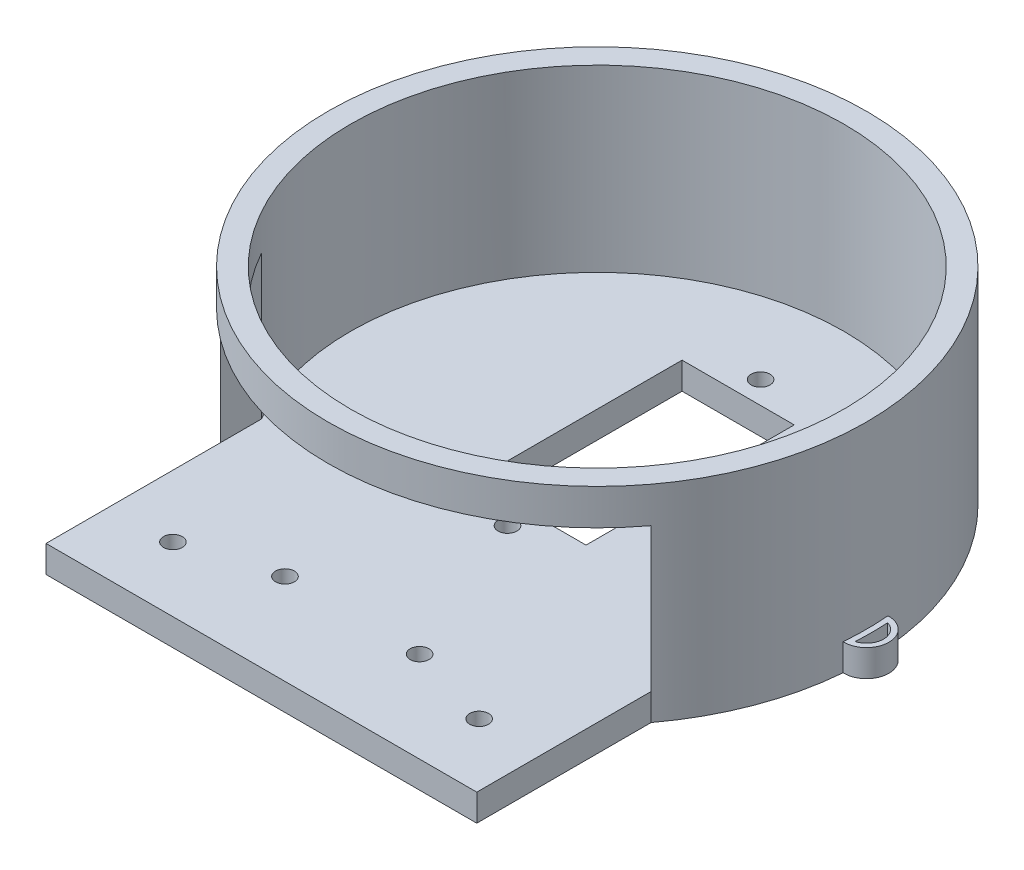
ISO-10303-21;
HEADER;
FILE_DESCRIPTION(('STEP AP214'),'2;1');
FILE_NAME('part.step','',(''),(''),'','','');
FILE_SCHEMA(('AUTOMOTIVE_DESIGN { 1 0 10303 214 1 1 1 1 }'));
ENDSEC;
DATA;
#1=APPLICATION_CONTEXT('core data for automotive mechanical design processes');
#2=APPLICATION_PROTOCOL_DEFINITION('international standard','automotive_design',2000,#1);
#3=PRODUCT_CONTEXT('',#1,'mechanical');
#4=PRODUCT('Part','Part','',(#3));
#5=PRODUCT_RELATED_PRODUCT_CATEGORY('part','',(#4));
#6=PRODUCT_DEFINITION_FORMATION('','',#4);
#7=PRODUCT_DEFINITION_CONTEXT('part definition',#1,'design');
#8=PRODUCT_DEFINITION('design','',#6,#7);
#9=PRODUCT_DEFINITION_SHAPE('','',#8);
#10=(LENGTH_UNIT() NAMED_UNIT(*) SI_UNIT(.MILLI.,.METRE.));
#11=(NAMED_UNIT(*) PLANE_ANGLE_UNIT() SI_UNIT($,.RADIAN.));
#12=(NAMED_UNIT(*) SI_UNIT($,.STERADIAN.) SOLID_ANGLE_UNIT());
#13=UNCERTAINTY_MEASURE_WITH_UNIT(LENGTH_MEASURE(1.E-05),#10,'distance_accuracy_value','');
#14=(GEOMETRIC_REPRESENTATION_CONTEXT(3) GLOBAL_UNCERTAINTY_ASSIGNED_CONTEXT((#13)) GLOBAL_UNIT_ASSIGNED_CONTEXT((#10,
#11,#12)) REPRESENTATION_CONTEXT('',''));
#15=CARTESIAN_POINT('',(0.,0.,0.));
#16=DIRECTION('',(0.,0.,1.));
#17=DIRECTION('',(1.,0.,0.));
#18=AXIS2_PLACEMENT_3D('',#15,#16,#17);
#19=CARTESIAN_POINT('',(-15.,3.,0.));
#20=DIRECTION('',(0.,1.,0.));
#21=DIRECTION('',(0.,0.,1.));
#22=AXIS2_PLACEMENT_3D('',#19,#20,#21);
#23=PLANE('',#22);
#24=CARTESIAN_POINT('',(0.,3.,0.));
#25=DIRECTION('',(0.,1.,0.));
#26=DIRECTION('',(0.,0.,1.));
#27=AXIS2_PLACEMENT_3D('',#24,#25,#26);
#28=CIRCLE('',#27,30.);
#29=CARTESIAN_POINT('',(29.8958333333333,3.,2.49782891839204));
#30=VERTEX_POINT('',#29);
#31=CARTESIAN_POINT('',(29.8958333333333,3.,-2.49782891839204));
#32=VERTEX_POINT('',#31);
#33=EDGE_CURVE('E52',#30,#32,#28,.T.);
#34=ORIENTED_EDGE('',*,*,#33,.F.);
#35=CARTESIAN_POINT('',(30.,3.,0.));
#36=DIRECTION('',(0.,1.,0.));
#37=DIRECTION('',(0.,0.,-1.));
#38=AXIS2_PLACEMENT_3D('',#35,#36,#37);
#39=CIRCLE('',#38,2.5);
#40=EDGE_CURVE('E432',#30,#32,#39,.T.);
#41=ORIENTED_EDGE('',*,*,#40,.T.);
#42=EDGE_LOOP('',(#34,#41));
#43=FACE_BOUND('',#42,.T.);
#44=CARTESIAN_POINT('',(30.,3.,0.));
#45=DIRECTION('',(0.,1.,0.));
#46=DIRECTION('',(0.,0.,1.));
#47=AXIS2_PLACEMENT_3D('',#44,#45,#46);
#48=CIRCLE('',#47,1.9);
#49=CARTESIAN_POINT('',(30.5458333333333,3.,1.81990823181341));
#50=VERTEX_POINT('',#49);
#51=CARTESIAN_POINT('',(30.5458333333333,3.,-1.81990823181341));
#52=VERTEX_POINT('',#51);
#53=EDGE_CURVE('E59',#50,#52,#48,.T.);
#54=ORIENTED_EDGE('',*,*,#53,.F.);
#55=CARTESIAN_POINT('',(0.,3.,0.));
#56=DIRECTION('',(0.,-1.,0.));
#57=DIRECTION('',(0.,0.,1.));
#58=AXIS2_PLACEMENT_3D('',#55,#56,#57);
#59=CIRCLE('',#58,30.6);
#60=EDGE_CURVE('E282',#52,#50,#59,.T.);
#61=ORIENTED_EDGE('',*,*,#60,.F.);
#62=EDGE_LOOP('',(#54,#61));
#63=FACE_BOUND('',#62,.T.);
#64=ADVANCED_FACE('F40',(#43,#63),#23,.T.);
#65=CARTESIAN_POINT('',(2.49782891839204,3.,-29.8958333333333));
#66=VERTEX_POINT('',#65);
#67=CARTESIAN_POINT('',(-2.49782891839204,3.,-29.8958333333333));
#68=VERTEX_POINT('',#67);
#69=EDGE_CURVE('E11',#66,#68,#28,.T.);
#70=ORIENTED_EDGE('',*,*,#69,.F.);
#71=CARTESIAN_POINT('',(0.,3.,-30.));
#72=DIRECTION('',(0.,1.,0.));
#73=DIRECTION('',(0.,0.,1.));
#74=AXIS2_PLACEMENT_3D('',#71,#72,#73);
#75=CIRCLE('',#74,2.5);
#76=EDGE_CURVE('E436',#66,#68,#75,.T.);
#77=ORIENTED_EDGE('',*,*,#76,.T.);
#78=EDGE_LOOP('',(#70,#77));
#79=FACE_BOUND('',#78,.T.);
#80=CARTESIAN_POINT('',(0.,3.,-30.));
#81=DIRECTION('',(0.,1.,0.));
#82=DIRECTION('',(0.,0.,1.));
#83=AXIS2_PLACEMENT_3D('',#80,#81,#82);
#84=CIRCLE('',#83,1.9);
#85=CARTESIAN_POINT('',(1.81990823181341,3.,-30.5458333333333));
#86=VERTEX_POINT('',#85);
#87=CARTESIAN_POINT('',(-1.8199082318134,3.,-30.5458333333333));
#88=VERTEX_POINT('',#87);
#89=EDGE_CURVE('E67',#86,#88,#84,.T.);
#90=ORIENTED_EDGE('',*,*,#89,.F.);
#91=CARTESIAN_POINT('',(0.,3.,0.));
#92=DIRECTION('',(0.,-1.,0.));
#93=DIRECTION('',(0.,0.,1.));
#94=AXIS2_PLACEMENT_3D('',#91,#92,#93);
#95=CIRCLE('',#94,30.6);
#96=EDGE_CURVE('E260',#88,#86,#95,.T.);
#97=ORIENTED_EDGE('',*,*,#96,.F.);
#98=EDGE_LOOP('',(#90,#97));
#99=FACE_BOUND('',#98,.T.);
#100=ADVANCED_FACE('F525',(#79,#99),#23,.T.);
#101=CARTESIAN_POINT('',(-29.8958333333333,3.,-2.49782891839204));
#102=VERTEX_POINT('',#101);
#103=CARTESIAN_POINT('',(-29.8958333333333,3.,2.49782891839204));
#104=VERTEX_POINT('',#103);
#105=EDGE_CURVE('E50',#102,#104,#28,.T.);
#106=ORIENTED_EDGE('',*,*,#105,.F.);
#107=CARTESIAN_POINT('',(-30.,3.,0.));
#108=DIRECTION('',(0.,1.,0.));
#109=DIRECTION('',(0.,0.,1.));
#110=AXIS2_PLACEMENT_3D('',#107,#108,#109);
#111=CIRCLE('',#110,2.5);
#112=EDGE_CURVE('E429',#102,#104,#111,.T.);
#113=ORIENTED_EDGE('',*,*,#112,.T.);
#114=EDGE_LOOP('',(#106,#113));
#115=FACE_BOUND('',#114,.T.);
#116=CARTESIAN_POINT('',(-30.,3.,0.));
#117=DIRECTION('',(0.,1.,0.));
#118=DIRECTION('',(0.,0.,1.));
#119=AXIS2_PLACEMENT_3D('',#116,#117,#118);
#120=CIRCLE('',#119,1.9);
#121=CARTESIAN_POINT('',(-30.5458333333333,3.,-1.81990823181342));
#122=VERTEX_POINT('',#121);
#123=CARTESIAN_POINT('',(-30.5458333333333,3.,1.81990823181342));
#124=VERTEX_POINT('',#123);
#125=EDGE_CURVE('E248',#122,#124,#120,.T.);
#126=ORIENTED_EDGE('',*,*,#125,.F.);
#127=CARTESIAN_POINT('',(0.,3.,0.));
#128=DIRECTION('',(0.,-1.,0.));
#129=DIRECTION('',(0.,0.,1.));
#130=AXIS2_PLACEMENT_3D('',#127,#128,#129);
#131=CIRCLE('',#130,30.6);
#132=EDGE_CURVE('E302',#124,#122,#131,.T.);
#133=ORIENTED_EDGE('',*,*,#132,.F.);
#134=EDGE_LOOP('',(#126,#133));
#135=FACE_BOUND('',#134,.T.);
#136=ADVANCED_FACE('F490',(#115,#135),#23,.T.);
#137=CARTESIAN_POINT('',(-15.,0.,0.));
#138=DIRECTION('',(0.,1.,0.));
#139=DIRECTION('',(0.,0.,1.));
#140=AXIS2_PLACEMENT_3D('',#137,#138,#139);
#141=PLANE('',#140);
#142=CARTESIAN_POINT('',(-17.0630475596303,0.,30.220638133164));
#143=DIRECTION('',(0.,1.,0.));
#144=DIRECTION('',(0.,0.,1.));
#145=AXIS2_PLACEMENT_3D('',#142,#143,#144);
#146=CIRCLE('',#145,1.05);
#147=CARTESIAN_POINT('',(-17.0630475596303,0.,31.270638133164));
#148=VERTEX_POINT('',#147);
#149=EDGE_CURVE('E243',#148,#148,#146,.T.);
#150=ORIENTED_EDGE('',*,*,#149,.T.);
#151=EDGE_LOOP('',(#150));
#152=FACE_BOUND('',#151,.T.);
#153=CARTESIAN_POINT('',(7.5,0.,27.2969210859366));
#154=DIRECTION('',(0.,1.,0.));
#155=DIRECTION('',(0.,0.,1.));
#156=AXIS2_PLACEMENT_3D('',#153,#154,#155);
#157=CIRCLE('',#156,1.05);
#158=CARTESIAN_POINT('',(7.5,0.,28.3469210859366));
#159=VERTEX_POINT('',#158);
#160=EDGE_CURVE('E594',#159,#159,#157,.T.);
#161=ORIENTED_EDGE('',*,*,#160,.T.);
#162=EDGE_LOOP('',(#161));
#163=FACE_BOUND('',#162,.T.);
#164=CARTESIAN_POINT('',(-7.5,0.,27.2969210859366));
#165=DIRECTION('',(0.,1.,0.));
#166=DIRECTION('',(0.,0.,1.));
#167=AXIS2_PLACEMENT_3D('',#164,#165,#166);
#168=CIRCLE('',#167,1.05);
#169=CARTESIAN_POINT('',(-7.5,0.,28.3469210859366));
#170=VERTEX_POINT('',#169);
#171=EDGE_CURVE('E586',#170,#170,#168,.T.);
#172=ORIENTED_EDGE('',*,*,#171,.T.);
#173=EDGE_LOOP('',(#172));
#174=FACE_BOUND('',#173,.T.);
#175=CARTESIAN_POINT('',(17.0630475596304,0.,30.220638133164));
#176=DIRECTION('',(0.,1.,0.));
#177=DIRECTION('',(0.,0.,1.));
#178=AXIS2_PLACEMENT_3D('',#175,#176,#177);
#179=CIRCLE('',#178,1.05000000000001);
#180=CARTESIAN_POINT('',(17.0630475596304,0.,31.270638133164));
#181=VERTEX_POINT('',#180);
#182=EDGE_CURVE('E578',#181,#181,#179,.T.);
#183=ORIENTED_EDGE('',*,*,#182,.T.);
#184=EDGE_LOOP('',(#183));
#185=FACE_BOUND('',#184,.T.);
#186=CARTESIAN_POINT('',(0.,0.,0.));
#187=DIRECTION('',(0.,1.,0.));
#188=DIRECTION('',(0.,0.,1.));
#189=AXIS2_PLACEMENT_3D('',#186,#187,#188);
#190=CIRCLE('',#189,30.);
#191=CARTESIAN_POINT('',(24.,0.,18.));
#192=VERTEX_POINT('',#191);
#193=CARTESIAN_POINT('',(29.8958333333333,0.,2.49782891839204));
#194=VERTEX_POINT('',#193);
#195=EDGE_CURVE('E222',#192,#194,#190,.T.);
#196=ORIENTED_EDGE('',*,*,#195,.F.);
#197=DIRECTION('',(0.,0.,-1.));
#198=VECTOR('',#197,1.);
#199=CARTESIAN_POINT('',(24.,0.,37.4242852856285));
#200=LINE('',#199,#198);
#201=CARTESIAN_POINT('',(24.,0.,37.4242852856285));
#202=VERTEX_POINT('',#201);
#203=EDGE_CURVE('E201',#202,#192,#200,.T.);
#204=ORIENTED_EDGE('',*,*,#203,.F.);
#205=DIRECTION('',(1.,0.,0.));
#206=VECTOR('',#205,1.);
#207=CARTESIAN_POINT('',(-24.,0.,37.4242852856285));
#208=LINE('',#207,#206);
#209=CARTESIAN_POINT('',(-24.,0.,37.4242852856285));
#210=VERTEX_POINT('',#209);
#211=EDGE_CURVE('E219',#210,#202,#208,.T.);
#212=ORIENTED_EDGE('',*,*,#211,.F.);
#213=DIRECTION('',(0.,0.,1.));
#214=VECTOR('',#213,1.);
#215=CARTESIAN_POINT('',(-24.,0.,18.));
#216=LINE('',#215,#214);
#217=CARTESIAN_POINT('',(-24.,0.,18.));
#218=VERTEX_POINT('',#217);
#219=EDGE_CURVE('E211',#218,#210,#216,.T.);
#220=ORIENTED_EDGE('',*,*,#219,.F.);
#221=CARTESIAN_POINT('',(-29.8958333333333,0.,2.49782891839204));
#222=VERTEX_POINT('',#221);
#223=EDGE_CURVE('E446',#222,#218,#190,.T.);
#224=ORIENTED_EDGE('',*,*,#223,.F.);
#225=CARTESIAN_POINT('',(-30.,0.,0.));
#226=DIRECTION('',(0.,1.,0.));
#227=DIRECTION('',(0.,0.,1.));
#228=AXIS2_PLACEMENT_3D('',#225,#226,#227);
#229=CIRCLE('',#228,2.5);
#230=CARTESIAN_POINT('',(-29.8958333333333,0.,-2.49782891839204));
#231=VERTEX_POINT('',#230);
#232=EDGE_CURVE('E443',#231,#222,#229,.T.);
#233=ORIENTED_EDGE('',*,*,#232,.F.);
#234=CARTESIAN_POINT('',(0.,0.,0.));
#235=DIRECTION('',(0.,1.,0.));
#236=DIRECTION('',(0.,0.,1.));
#237=AXIS2_PLACEMENT_3D('',#234,#235,#236);
#238=CIRCLE('',#237,30.);
#239=CARTESIAN_POINT('',(-2.49782891839204,0.,-29.8958333333333));
#240=VERTEX_POINT('',#239);
#241=EDGE_CURVE('E428',#240,#231,#238,.T.);
#242=ORIENTED_EDGE('',*,*,#241,.F.);
#243=CARTESIAN_POINT('',(0.,0.,-30.));
#244=DIRECTION('',(0.,1.,0.));
#245=DIRECTION('',(0.,0.,1.));
#246=AXIS2_PLACEMENT_3D('',#243,#244,#245);
#247=CIRCLE('',#246,2.5);
#248=CARTESIAN_POINT('',(2.49782891839204,0.,-29.8958333333333));
#249=VERTEX_POINT('',#248);
#250=EDGE_CURVE('E433',#249,#240,#247,.T.);
#251=ORIENTED_EDGE('',*,*,#250,.F.);
#252=CARTESIAN_POINT('',(0.,0.,0.));
#253=DIRECTION('',(0.,1.,0.));
#254=DIRECTION('',(0.,0.,1.));
#255=AXIS2_PLACEMENT_3D('',#252,#253,#254);
#256=CIRCLE('',#255,30.);
#257=CARTESIAN_POINT('',(29.8958333333333,0.,-2.49782891839204));
#258=VERTEX_POINT('',#257);
#259=EDGE_CURVE('E453',#258,#249,#256,.T.);
#260=ORIENTED_EDGE('',*,*,#259,.F.);
#261=CARTESIAN_POINT('',(30.,0.,0.));
#262=DIRECTION('',(0.,1.,0.));
#263=DIRECTION('',(0.,0.,-1.));
#264=AXIS2_PLACEMENT_3D('',#261,#262,#263);
#265=CIRCLE('',#264,2.5);
#266=EDGE_CURVE('E450',#194,#258,#265,.T.);
#267=ORIENTED_EDGE('',*,*,#266,.F.);
#268=EDGE_LOOP('',(#196,#204,#212,#220,#224,#233,#242,#251,#260,#267));
#269=FACE_BOUND('',#268,.T.);
#270=CARTESIAN_POINT('',(0.,0.,-18.2));
#271=DIRECTION('',(0.,1.,0.));
#272=DIRECTION('',(0.,0.,1.));
#273=AXIS2_PLACEMENT_3D('',#270,#271,#272);
#274=CIRCLE('',#273,1.05);
#275=CARTESIAN_POINT('',(0.,0.,-17.15));
#276=VERTEX_POINT('',#275);
#277=EDGE_CURVE('E356',#276,#276,#274,.T.);
#278=ORIENTED_EDGE('',*,*,#277,.T.);
#279=EDGE_LOOP('',(#278));
#280=FACE_BOUND('',#279,.T.);
#281=CARTESIAN_POINT('',(0.,0.,9.99999999999999));
#282=DIRECTION('',(0.,1.,0.));
#283=DIRECTION('',(0.,0.,1.));
#284=AXIS2_PLACEMENT_3D('',#281,#282,#283);
#285=CIRCLE('',#284,1.05);
#286=CARTESIAN_POINT('',(0.,0.,11.05));
#287=VERTEX_POINT('',#286);
#288=EDGE_CURVE('E365',#287,#287,#285,.T.);
#289=ORIENTED_EDGE('',*,*,#288,.T.);
#290=EDGE_LOOP('',(#289));
#291=FACE_BOUND('',#290,.T.);
#292=DIRECTION('',(0.,0.,1.));
#293=VECTOR('',#292,1.);
#294=CARTESIAN_POINT('',(-6.25,0.,-15.7));
#295=LINE('',#294,#293);
#296=CARTESIAN_POINT('',(-6.25,0.,-15.7));
#297=VERTEX_POINT('',#296);
#298=CARTESIAN_POINT('',(-6.25,0.,7.5));
#299=VERTEX_POINT('',#298);
#300=EDGE_CURVE('E382',#297,#299,#295,.T.);
#301=ORIENTED_EDGE('',*,*,#300,.T.);
#302=DIRECTION('',(1.,0.,0.));
#303=VECTOR('',#302,1.);
#304=CARTESIAN_POINT('',(-6.25,0.,7.5));
#305=LINE('',#304,#303);
#306=CARTESIAN_POINT('',(6.25,0.,7.5));
#307=VERTEX_POINT('',#306);
#308=EDGE_CURVE('E404',#299,#307,#305,.T.);
#309=ORIENTED_EDGE('',*,*,#308,.T.);
#310=DIRECTION('',(0.,0.,-1.));
#311=VECTOR('',#310,1.);
#312=CARTESIAN_POINT('',(6.25,0.,-15.7));
#313=LINE('',#312,#311);
#314=CARTESIAN_POINT('',(6.25,0.,-15.7));
#315=VERTEX_POINT('',#314);
#316=EDGE_CURVE('E408',#307,#315,#313,.T.);
#317=ORIENTED_EDGE('',*,*,#316,.T.);
#318=DIRECTION('',(-1.,0.,0.));
#319=VECTOR('',#318,1.);
#320=CARTESIAN_POINT('',(-6.25,0.,-15.7));
#321=LINE('',#320,#319);
#322=EDGE_CURVE('E390',#315,#297,#321,.T.);
#323=ORIENTED_EDGE('',*,*,#322,.T.);
#324=EDGE_LOOP('',(#301,#309,#317,#323));
#325=FACE_BOUND('',#324,.T.);
#326=CARTESIAN_POINT('',(0.,0.,0.));
#327=DIRECTION('',(0.,-1.,0.));
#328=DIRECTION('',(0.,0.,1.));
#329=AXIS2_PLACEMENT_3D('',#326,#327,#328);
#330=CIRCLE('',#329,30.6);
#331=CARTESIAN_POINT('',(-30.5458333333333,0.,1.81990823181342));
#332=VERTEX_POINT('',#331);
#333=CARTESIAN_POINT('',(-30.5458333333333,0.,-1.81990823181342));
#334=VERTEX_POINT('',#333);
#335=EDGE_CURVE('E301',#332,#334,#330,.T.);
#336=ORIENTED_EDGE('',*,*,#335,.T.);
#337=CARTESIAN_POINT('',(-30.,0.,0.));
#338=DIRECTION('',(0.,1.,0.));
#339=DIRECTION('',(0.,0.,1.));
#340=AXIS2_PLACEMENT_3D('',#337,#338,#339);
#341=CIRCLE('',#340,1.9);
#342=EDGE_CURVE('E297',#334,#332,#341,.T.);
#343=ORIENTED_EDGE('',*,*,#342,.T.);
#344=EDGE_LOOP('',(#336,#343));
#345=FACE_BOUND('',#344,.T.);
#346=CARTESIAN_POINT('',(0.,0.,0.));
#347=DIRECTION('',(0.,-1.,0.));
#348=DIRECTION('',(0.,0.,1.));
#349=AXIS2_PLACEMENT_3D('',#346,#347,#348);
#350=CIRCLE('',#349,30.6);
#351=CARTESIAN_POINT('',(30.5458333333333,0.,-1.81990823181341));
#352=VERTEX_POINT('',#351);
#353=CARTESIAN_POINT('',(30.5458333333333,0.,1.81990823181341));
#354=VERTEX_POINT('',#353);
#355=EDGE_CURVE('E281',#352,#354,#350,.T.);
#356=ORIENTED_EDGE('',*,*,#355,.T.);
#357=CARTESIAN_POINT('',(30.,0.,0.));
#358=DIRECTION('',(0.,1.,0.));
#359=DIRECTION('',(0.,0.,1.));
#360=AXIS2_PLACEMENT_3D('',#357,#358,#359);
#361=CIRCLE('',#360,1.9);
#362=EDGE_CURVE('E277',#354,#352,#361,.T.);
#363=ORIENTED_EDGE('',*,*,#362,.T.);
#364=EDGE_LOOP('',(#356,#363));
#365=FACE_BOUND('',#364,.T.);
#366=CARTESIAN_POINT('',(0.,0.,0.));
#367=DIRECTION('',(0.,-1.,0.));
#368=DIRECTION('',(0.,0.,1.));
#369=AXIS2_PLACEMENT_3D('',#366,#367,#368);
#370=CIRCLE('',#369,30.6);
#371=CARTESIAN_POINT('',(-1.8199082318134,0.,-30.5458333333333));
#372=VERTEX_POINT('',#371);
#373=CARTESIAN_POINT('',(1.81990823181341,0.,-30.5458333333333));
#374=VERTEX_POINT('',#373);
#375=EDGE_CURVE('E259',#372,#374,#370,.T.);
#376=ORIENTED_EDGE('',*,*,#375,.T.);
#377=CARTESIAN_POINT('',(0.,0.,-30.));
#378=DIRECTION('',(0.,1.,0.));
#379=DIRECTION('',(0.,0.,1.));
#380=AXIS2_PLACEMENT_3D('',#377,#378,#379);
#381=CIRCLE('',#380,1.9);
#382=EDGE_CURVE('E255',#374,#372,#381,.T.);
#383=ORIENTED_EDGE('',*,*,#382,.T.);
#384=EDGE_LOOP('',(#376,#383));
#385=FACE_BOUND('',#384,.T.);
#386=ADVANCED_FACE('F216',(#152,#163,#174,#185,#269,#280,#291,#325,#345,#365,#385),#141,.F.);
#387=CARTESIAN_POINT('',(0.,23.,0.));
#388=DIRECTION('',(0.,-1.,0.));
#389=DIRECTION('',(0.,0.,-1.));
#390=AXIS2_PLACEMENT_3D('',#387,#388,#389);
#391=CYLINDRICAL_SURFACE('',#390,27.5);
#392=CARTESIAN_POINT('',(0.,23.,0.));
#393=DIRECTION('',(0.,1.,0.));
#394=DIRECTION('',(0.,0.,1.));
#395=AXIS2_PLACEMENT_3D('',#392,#393,#394);
#396=CIRCLE('',#395,27.5);
#397=CARTESIAN_POINT('',(0.,23.,27.5));
#398=VERTEX_POINT('',#397);
#399=EDGE_CURVE('E372',#398,#398,#396,.T.);
#400=ORIENTED_EDGE('',*,*,#399,.T.);
#401=EDGE_LOOP('',(#400));
#402=FACE_BOUND('',#401,.T.);
#403=CARTESIAN_POINT('',(0.,3.,0.));
#404=DIRECTION('',(0.,1.,0.));
#405=DIRECTION('',(0.,0.,1.));
#406=AXIS2_PLACEMENT_3D('',#403,#404,#405);
#407=CIRCLE('',#406,27.5);
#408=CARTESIAN_POINT('',(24.,3.,13.4257215820975));
#409=VERTEX_POINT('',#408);
#410=CARTESIAN_POINT('',(-24.,3.,13.4257215820976));
#411=VERTEX_POINT('',#410);
#412=EDGE_CURVE('E360',#409,#411,#407,.T.);
#413=ORIENTED_EDGE('',*,*,#412,.F.);
#414=DIRECTION('',(0.,-1.,0.));
#415=VECTOR('',#414,1.);
#416=CARTESIAN_POINT('',(24.,23.,13.4257215820976));
#417=LINE('',#416,#415);
#418=CARTESIAN_POINT('',(24.,19.,13.4257215820975));
#419=VERTEX_POINT('',#418);
#420=EDGE_CURVE('E321',#419,#409,#417,.T.);
#421=ORIENTED_EDGE('',*,*,#420,.F.);
#422=CARTESIAN_POINT('',(0.,19.,0.));
#423=DIRECTION('',(0.,1.,0.));
#424=DIRECTION('',(-1.,0.,0.));
#425=AXIS2_PLACEMENT_3D('',#422,#423,#424);
#426=CIRCLE('',#425,27.5);
#427=CARTESIAN_POINT('',(-24.,19.,13.4257215820976));
#428=VERTEX_POINT('',#427);
#429=EDGE_CURVE('E348',#419,#428,#426,.F.);
#430=ORIENTED_EDGE('',*,*,#429,.T.);
#431=DIRECTION('',(0.,-1.,0.));
#432=VECTOR('',#431,1.);
#433=CARTESIAN_POINT('',(-24.,23.,13.4257215820976));
#434=LINE('',#433,#432);
#435=EDGE_CURVE('E274',#411,#428,#434,.F.);
#436=ORIENTED_EDGE('',*,*,#435,.F.);
#437=EDGE_LOOP('',(#413,#421,#430,#436));
#438=FACE_BOUND('',#437,.T.);
#439=ADVANCED_FACE('F506',(#402,#438),#391,.F.);
#440=CARTESIAN_POINT('',(0.,3.,0.));
#441=DIRECTION('',(0.,-1.,0.));
#442=DIRECTION('',(0.,0.,-1.));
#443=AXIS2_PLACEMENT_3D('',#440,#441,#442);
#444=CYLINDRICAL_SURFACE('',#443,30.);
#445=CARTESIAN_POINT('',(0.,23.,0.));
#446=DIRECTION('',(0.,1.,0.));
#447=DIRECTION('',(0.,0.,1.));
#448=AXIS2_PLACEMENT_3D('',#445,#446,#447);
#449=CIRCLE('',#448,30.);
#450=CARTESIAN_POINT('',(0.,23.,30.));
#451=VERTEX_POINT('',#450);
#452=EDGE_CURVE('E379',#451,#451,#449,.T.);
#453=ORIENTED_EDGE('',*,*,#452,.F.);
#454=EDGE_LOOP('',(#453));
#455=FACE_BOUND('',#454,.T.);
#456=ORIENTED_EDGE('',*,*,#223,.T.);
#457=DIRECTION('',(0.,1.,0.));
#458=VECTOR('',#457,1.);
#459=CARTESIAN_POINT('',(-24.,0.,18.));
#460=LINE('',#459,#458);
#461=CARTESIAN_POINT('',(-24.,3.,18.));
#462=VERTEX_POINT('',#461);
#463=EDGE_CURVE('E249',#218,#462,#460,.T.);
#464=ORIENTED_EDGE('',*,*,#463,.T.);
#465=DIRECTION('',(0.,-1.,0.));
#466=VECTOR('',#465,1.);
#467=CARTESIAN_POINT('',(-24.,3.,18.));
#468=LINE('',#467,#466);
#469=CARTESIAN_POINT('',(-24.,19.,18.));
#470=VERTEX_POINT('',#469);
#471=EDGE_CURVE('E317',#462,#470,#468,.F.);
#472=ORIENTED_EDGE('',*,*,#471,.T.);
#473=CARTESIAN_POINT('',(0.,19.,0.));
#474=DIRECTION('',(0.,1.,0.));
#475=DIRECTION('',(-1.,0.,0.));
#476=AXIS2_PLACEMENT_3D('',#473,#474,#475);
#477=CIRCLE('',#476,30.);
#478=CARTESIAN_POINT('',(24.,19.,18.));
#479=VERTEX_POINT('',#478);
#480=EDGE_CURVE('E352',#479,#470,#477,.F.);
#481=ORIENTED_EDGE('',*,*,#480,.F.);
#482=DIRECTION('',(0.,-1.,0.));
#483=VECTOR('',#482,1.);
#484=CARTESIAN_POINT('',(24.,3.,18.));
#485=LINE('',#484,#483);
#486=CARTESIAN_POINT('',(24.,3.,18.));
#487=VERTEX_POINT('',#486);
#488=EDGE_CURVE('E333',#479,#487,#485,.T.);
#489=ORIENTED_EDGE('',*,*,#488,.T.);
#490=DIRECTION('',(0.,1.,0.));
#491=VECTOR('',#490,1.);
#492=CARTESIAN_POINT('',(24.,0.,18.));
#493=LINE('',#492,#491);
#494=EDGE_CURVE('E210',#192,#487,#493,.T.);
#495=ORIENTED_EDGE('',*,*,#494,.F.);
#496=ORIENTED_EDGE('',*,*,#195,.T.);
#497=DIRECTION('',(0.,-1.,0.));
#498=VECTOR('',#497,1.);
#499=CARTESIAN_POINT('',(29.8958333333333,3.,2.49782891839204));
#500=LINE('',#499,#498);
#501=EDGE_CURVE('E469',#30,#194,#500,.T.);
#502=ORIENTED_EDGE('',*,*,#501,.F.);
#503=ORIENTED_EDGE('',*,*,#33,.T.);
#504=DIRECTION('',(0.,-1.,0.));
#505=VECTOR('',#504,1.);
#506=CARTESIAN_POINT('',(29.8958333333333,3.,-2.49782891839204));
#507=LINE('',#506,#505);
#508=EDGE_CURVE('E465',#32,#258,#507,.T.);
#509=ORIENTED_EDGE('',*,*,#508,.T.);
#510=ORIENTED_EDGE('',*,*,#259,.T.);
#511=DIRECTION('',(0.,-1.,0.));
#512=VECTOR('',#511,1.);
#513=CARTESIAN_POINT('',(2.49782891839204,3.,-29.8958333333333));
#514=LINE('',#513,#512);
#515=EDGE_CURVE('E461',#66,#249,#514,.T.);
#516=ORIENTED_EDGE('',*,*,#515,.F.);
#517=ORIENTED_EDGE('',*,*,#69,.T.);
#518=DIRECTION('',(0.,-1.,0.));
#519=VECTOR('',#518,1.);
#520=CARTESIAN_POINT('',(-2.49782891839204,3.,-29.8958333333333));
#521=LINE('',#520,#519);
#522=EDGE_CURVE('E439',#68,#240,#521,.T.);
#523=ORIENTED_EDGE('',*,*,#522,.T.);
#524=ORIENTED_EDGE('',*,*,#241,.T.);
#525=DIRECTION('',(0.,-1.,0.));
#526=VECTOR('',#525,1.);
#527=CARTESIAN_POINT('',(-29.8958333333333,3.,-2.49782891839204));
#528=LINE('',#527,#526);
#529=EDGE_CURVE('E44',#102,#231,#528,.T.);
#530=ORIENTED_EDGE('',*,*,#529,.F.);
#531=ORIENTED_EDGE('',*,*,#105,.T.);
#532=DIRECTION('',(0.,-1.,0.));
#533=VECTOR('',#532,1.);
#534=CARTESIAN_POINT('',(-29.8958333333333,3.,2.49782891839204));
#535=LINE('',#534,#533);
#536=EDGE_CURVE('E472',#104,#222,#535,.T.);
#537=ORIENTED_EDGE('',*,*,#536,.T.);
#538=EDGE_LOOP('',(#456,#464,#472,#481,#489,#495,#496,#502,#503,#509,#510,#516,#517,#523,#524,
#530,#531,#537));
#539=FACE_BOUND('',#538,.T.);
#540=ADVANCED_FACE('F488',(#455,#539),#444,.T.);
#541=CARTESIAN_POINT('',(-17.0630475596303,3.,30.220638133164));
#542=DIRECTION('',(0.,1.,0.));
#543=DIRECTION('',(0.,0.,1.));
#544=AXIS2_PLACEMENT_3D('',#541,#542,#543);
#545=CIRCLE('',#544,1.05);
#546=CARTESIAN_POINT('',(-17.0630475596303,3.,31.270638133164));
#547=VERTEX_POINT('',#546);
#548=EDGE_CURVE('E565',#547,#547,#545,.T.);
#549=ORIENTED_EDGE('',*,*,#548,.F.);
#550=EDGE_LOOP('',(#549));
#551=FACE_BOUND('',#550,.T.);
#552=CARTESIAN_POINT('',(7.5,3.,27.2969210859366));
#553=DIRECTION('',(0.,1.,0.));
#554=DIRECTION('',(0.,0.,1.));
#555=AXIS2_PLACEMENT_3D('',#552,#553,#554);
#556=CIRCLE('',#555,1.05);
#557=CARTESIAN_POINT('',(7.5,3.,28.3469210859366));
#558=VERTEX_POINT('',#557);
#559=EDGE_CURVE('E569',#558,#558,#556,.T.);
#560=ORIENTED_EDGE('',*,*,#559,.F.);
#561=EDGE_LOOP('',(#560));
#562=FACE_BOUND('',#561,.T.);
#563=CARTESIAN_POINT('',(-7.5,3.,27.2969210859366));
#564=DIRECTION('',(0.,1.,0.));
#565=DIRECTION('',(0.,0.,1.));
#566=AXIS2_PLACEMENT_3D('',#563,#564,#565);
#567=CIRCLE('',#566,1.05);
#568=CARTESIAN_POINT('',(-7.5,3.,28.3469210859366));
#569=VERTEX_POINT('',#568);
#570=EDGE_CURVE('E573',#569,#569,#567,.T.);
#571=ORIENTED_EDGE('',*,*,#570,.F.);
#572=EDGE_LOOP('',(#571));
#573=FACE_BOUND('',#572,.T.);
#574=CARTESIAN_POINT('',(17.0630475596304,3.,30.220638133164));
#575=DIRECTION('',(0.,1.,0.));
#576=DIRECTION('',(0.,0.,1.));
#577=AXIS2_PLACEMENT_3D('',#574,#575,#576);
#578=CIRCLE('',#577,1.05000000000001);
#579=CARTESIAN_POINT('',(17.0630475596304,3.,31.270638133164));
#580=VERTEX_POINT('',#579);
#581=EDGE_CURVE('E235',#580,#580,#578,.T.);
#582=ORIENTED_EDGE('',*,*,#581,.F.);
#583=EDGE_LOOP('',(#582));
#584=FACE_BOUND('',#583,.T.);
#585=DIRECTION('',(0.,0.,-1.));
#586=VECTOR('',#585,1.);
#587=CARTESIAN_POINT('',(24.,3.,37.4242852856285));
#588=LINE('',#587,#586);
#589=CARTESIAN_POINT('',(24.,3.,37.4242852856285));
#590=VERTEX_POINT('',#589);
#591=EDGE_CURVE('E204',#590,#487,#588,.T.);
#592=ORIENTED_EDGE('',*,*,#591,.T.);
#593=DIRECTION('',(0.,0.,1.));
#594=VECTOR('',#593,1.);
#595=CARTESIAN_POINT('',(24.,3.,-32.501));
#596=LINE('',#595,#594);
#597=EDGE_CURVE('E337',#409,#487,#596,.T.);
#598=ORIENTED_EDGE('',*,*,#597,.F.);
#599=ORIENTED_EDGE('',*,*,#412,.T.);
#600=DIRECTION('',(0.,0.,1.));
#601=VECTOR('',#600,1.);
#602=CARTESIAN_POINT('',(-24.,3.,-32.501));
#603=LINE('',#602,#601);
#604=EDGE_CURVE('E322',#411,#462,#603,.T.);
#605=ORIENTED_EDGE('',*,*,#604,.T.);
#606=DIRECTION('',(0.,0.,1.));
#607=VECTOR('',#606,1.);
#608=CARTESIAN_POINT('',(-24.,3.,18.));
#609=LINE('',#608,#607);
#610=CARTESIAN_POINT('',(-24.,3.,37.4242852856285));
#611=VERTEX_POINT('',#610);
#612=EDGE_CURVE('E228',#462,#611,#609,.T.);
#613=ORIENTED_EDGE('',*,*,#612,.T.);
#614=DIRECTION('',(1.,0.,0.));
#615=VECTOR('',#614,1.);
#616=CARTESIAN_POINT('',(-24.,3.,37.4242852856285));
#617=LINE('',#616,#615);
#618=EDGE_CURVE('E240',#611,#590,#617,.T.);
#619=ORIENTED_EDGE('',*,*,#618,.T.);
#620=EDGE_LOOP('',(#592,#598,#599,#605,#613,#619));
#621=FACE_BOUND('',#620,.T.);
#622=CARTESIAN_POINT('',(0.,3.,-18.2));
#623=DIRECTION('',(0.,1.,0.));
#624=DIRECTION('',(0.,0.,1.));
#625=AXIS2_PLACEMENT_3D('',#622,#623,#624);
#626=CIRCLE('',#625,1.05);
#627=CARTESIAN_POINT('',(0.,3.,-17.15));
#628=VERTEX_POINT('',#627);
#629=EDGE_CURVE('E361',#628,#628,#626,.T.);
#630=ORIENTED_EDGE('',*,*,#629,.F.);
#631=EDGE_LOOP('',(#630));
#632=FACE_BOUND('',#631,.T.);
#633=CARTESIAN_POINT('',(0.,3.,9.99999999999999));
#634=DIRECTION('',(0.,1.,0.));
#635=DIRECTION('',(0.,0.,1.));
#636=AXIS2_PLACEMENT_3D('',#633,#634,#635);
#637=CIRCLE('',#636,1.05);
#638=CARTESIAN_POINT('',(0.,3.,11.05));
#639=VERTEX_POINT('',#638);
#640=EDGE_CURVE('E355',#639,#639,#637,.T.);
#641=ORIENTED_EDGE('',*,*,#640,.F.);
#642=EDGE_LOOP('',(#641));
#643=FACE_BOUND('',#642,.T.);
#644=DIRECTION('',(1.,0.,0.));
#645=VECTOR('',#644,1.);
#646=CARTESIAN_POINT('',(-6.25,3.,7.5));
#647=LINE('',#646,#645);
#648=CARTESIAN_POINT('',(-6.25,3.,7.5));
#649=VERTEX_POINT('',#648);
#650=CARTESIAN_POINT('',(6.25,3.,7.5));
#651=VERTEX_POINT('',#650);
#652=EDGE_CURVE('E389',#649,#651,#647,.T.);
#653=ORIENTED_EDGE('',*,*,#652,.F.);
#654=DIRECTION('',(0.,0.,1.));
#655=VECTOR('',#654,1.);
#656=CARTESIAN_POINT('',(-6.25,3.,-15.7));
#657=LINE('',#656,#655);
#658=CARTESIAN_POINT('',(-6.25,3.,-15.7));
#659=VERTEX_POINT('',#658);
#660=EDGE_CURVE('E386',#659,#649,#657,.T.);
#661=ORIENTED_EDGE('',*,*,#660,.F.);
#662=DIRECTION('',(-1.,0.,0.));
#663=VECTOR('',#662,1.);
#664=CARTESIAN_POINT('',(-6.25,3.,-15.7));
#665=LINE('',#664,#663);
#666=CARTESIAN_POINT('',(6.25,3.,-15.7));
#667=VERTEX_POINT('',#666);
#668=EDGE_CURVE('E397',#667,#659,#665,.T.);
#669=ORIENTED_EDGE('',*,*,#668,.F.);
#670=DIRECTION('',(0.,0.,-1.));
#671=VECTOR('',#670,1.);
#672=CARTESIAN_POINT('',(6.25,3.,-15.7));
#673=LINE('',#672,#671);
#674=EDGE_CURVE('E393',#651,#667,#673,.T.);
#675=ORIENTED_EDGE('',*,*,#674,.F.);
#676=EDGE_LOOP('',(#653,#661,#669,#675));
#677=FACE_BOUND('',#676,.T.);
#678=ADVANCED_FACE('F501',(#551,#562,#573,#584,#621,#632,#643,#677),#23,.T.);
#679=CARTESIAN_POINT('',(-30.,3.,0.));
#680=DIRECTION('',(0.,-1.,0.));
#681=DIRECTION('',(0.,0.,-1.));
#682=AXIS2_PLACEMENT_3D('',#679,#680,#681);
#683=CYLINDRICAL_SURFACE('',#682,2.5);
#684=ORIENTED_EDGE('',*,*,#232,.T.);
#685=ORIENTED_EDGE('',*,*,#536,.F.);
#686=ORIENTED_EDGE('',*,*,#112,.F.);
#687=ORIENTED_EDGE('',*,*,#529,.T.);
#688=EDGE_LOOP('',(#684,#685,#686,#687));
#689=FACE_BOUND('',#688,.T.);
#690=ADVANCED_FACE('F42',(#689),#683,.T.);
#691=CARTESIAN_POINT('',(30.,3.,0.));
#692=DIRECTION('',(0.,-1.,0.));
#693=DIRECTION('',(0.,0.,-1.));
#694=AXIS2_PLACEMENT_3D('',#691,#692,#693);
#695=CYLINDRICAL_SURFACE('',#694,2.5);
#696=ORIENTED_EDGE('',*,*,#266,.T.);
#697=ORIENTED_EDGE('',*,*,#508,.F.);
#698=ORIENTED_EDGE('',*,*,#40,.F.);
#699=ORIENTED_EDGE('',*,*,#501,.T.);
#700=EDGE_LOOP('',(#696,#697,#698,#699));
#701=FACE_BOUND('',#700,.T.);
#702=ADVANCED_FACE('F516',(#701),#695,.T.);
#703=CARTESIAN_POINT('',(0.,3.,-30.));
#704=DIRECTION('',(0.,-1.,0.));
#705=DIRECTION('',(0.,0.,-1.));
#706=AXIS2_PLACEMENT_3D('',#703,#704,#705);
#707=CYLINDRICAL_SURFACE('',#706,2.5);
#708=ORIENTED_EDGE('',*,*,#250,.T.);
#709=ORIENTED_EDGE('',*,*,#522,.F.);
#710=ORIENTED_EDGE('',*,*,#76,.F.);
#711=ORIENTED_EDGE('',*,*,#515,.T.);
#712=EDGE_LOOP('',(#708,#709,#710,#711));
#713=FACE_BOUND('',#712,.T.);
#714=ADVANCED_FACE('F522',(#713),#707,.T.);
#715=CARTESIAN_POINT('',(-6.25,3.,-15.7));
#716=DIRECTION('',(1.,0.,0.));
#717=DIRECTION('',(0.,0.,-1.));
#718=AXIS2_PLACEMENT_3D('',#715,#716,#717);
#719=PLANE('',#718);
#720=ORIENTED_EDGE('',*,*,#300,.F.);
#721=DIRECTION('',(0.,-1.,0.));
#722=VECTOR('',#721,1.);
#723=CARTESIAN_POINT('',(-6.25,3.,-15.7));
#724=LINE('',#723,#722);
#725=EDGE_CURVE('E400',#659,#297,#724,.T.);
#726=ORIENTED_EDGE('',*,*,#725,.F.);
#727=ORIENTED_EDGE('',*,*,#660,.T.);
#728=DIRECTION('',(0.,-1.,0.));
#729=VECTOR('',#728,1.);
#730=CARTESIAN_POINT('',(-6.25,3.,7.5));
#731=LINE('',#730,#729);
#732=EDGE_CURVE('E424',#649,#299,#731,.T.);
#733=ORIENTED_EDGE('',*,*,#732,.T.);
#734=EDGE_LOOP('',(#720,#726,#727,#733));
#735=FACE_BOUND('',#734,.T.);
#736=ADVANCED_FACE('F677',(#735),#719,.T.);
#737=CARTESIAN_POINT('',(-6.25,3.,7.5));
#738=DIRECTION('',(0.,0.,-1.));
#739=DIRECTION('',(-1.,0.,0.));
#740=AXIS2_PLACEMENT_3D('',#737,#738,#739);
#741=PLANE('',#740);
#742=ORIENTED_EDGE('',*,*,#308,.F.);
#743=ORIENTED_EDGE('',*,*,#732,.F.);
#744=ORIENTED_EDGE('',*,*,#652,.T.);
#745=DIRECTION('',(0.,-1.,0.));
#746=VECTOR('',#745,1.);
#747=CARTESIAN_POINT('',(6.25,3.,7.5));
#748=LINE('',#747,#746);
#749=EDGE_CURVE('E421',#651,#307,#748,.T.);
#750=ORIENTED_EDGE('',*,*,#749,.T.);
#751=EDGE_LOOP('',(#742,#743,#744,#750));
#752=FACE_BOUND('',#751,.T.);
#753=ADVANCED_FACE('F674',(#752),#741,.T.);
#754=CARTESIAN_POINT('',(6.25,3.,-15.7));
#755=DIRECTION('',(-1.,0.,0.));
#756=DIRECTION('',(0.,0.,1.));
#757=AXIS2_PLACEMENT_3D('',#754,#755,#756);
#758=PLANE('',#757);
#759=ORIENTED_EDGE('',*,*,#316,.F.);
#760=ORIENTED_EDGE('',*,*,#749,.F.);
#761=ORIENTED_EDGE('',*,*,#674,.T.);
#762=DIRECTION('',(0.,-1.,0.));
#763=VECTOR('',#762,1.);
#764=CARTESIAN_POINT('',(6.25,3.,-15.7));
#765=LINE('',#764,#763);
#766=EDGE_CURVE('E418',#667,#315,#765,.T.);
#767=ORIENTED_EDGE('',*,*,#766,.T.);
#768=EDGE_LOOP('',(#759,#760,#761,#767));
#769=FACE_BOUND('',#768,.T.);
#770=ADVANCED_FACE('F670',(#769),#758,.T.);
#771=CARTESIAN_POINT('',(-6.25,3.,-15.7));
#772=DIRECTION('',(0.,0.,1.));
#773=DIRECTION('',(1.,0.,0.));
#774=AXIS2_PLACEMENT_3D('',#771,#772,#773);
#775=PLANE('',#774);
#776=ORIENTED_EDGE('',*,*,#322,.F.);
#777=ORIENTED_EDGE('',*,*,#766,.F.);
#778=ORIENTED_EDGE('',*,*,#668,.T.);
#779=ORIENTED_EDGE('',*,*,#725,.T.);
#780=EDGE_LOOP('',(#776,#777,#778,#779));
#781=FACE_BOUND('',#780,.T.);
#782=ADVANCED_FACE('F666',(#781),#775,.T.);
#783=CARTESIAN_POINT('',(0.,23.,0.));
#784=DIRECTION('',(0.,1.,0.));
#785=DIRECTION('',(0.,0.,1.));
#786=AXIS2_PLACEMENT_3D('',#783,#784,#785);
#787=PLANE('',#786);
#788=ORIENTED_EDGE('',*,*,#452,.T.);
#789=EDGE_LOOP('',(#788));
#790=FACE_BOUND('',#789,.T.);
#791=ORIENTED_EDGE('',*,*,#399,.F.);
#792=EDGE_LOOP('',(#791));
#793=FACE_BOUND('',#792,.T.);
#794=ADVANCED_FACE('F661',(#790,#793),#787,.T.);
#795=CARTESIAN_POINT('',(0.,0.,9.99999999999999));
#796=DIRECTION('',(0.,1.,0.));
#797=DIRECTION('',(0.,0.,1.));
#798=AXIS2_PLACEMENT_3D('',#795,#796,#797);
#799=CYLINDRICAL_SURFACE('',#798,1.05);
#800=ORIENTED_EDGE('',*,*,#288,.F.);
#801=EDGE_LOOP('',(#800));
#802=FACE_BOUND('',#801,.T.);
#803=ORIENTED_EDGE('',*,*,#640,.T.);
#804=EDGE_LOOP('',(#803));
#805=FACE_BOUND('',#804,.T.);
#806=ADVANCED_FACE('F658',(#802,#805),#799,.F.);
#807=CARTESIAN_POINT('',(0.,0.,-18.2));
#808=DIRECTION('',(0.,1.,0.));
#809=DIRECTION('',(0.,0.,1.));
#810=AXIS2_PLACEMENT_3D('',#807,#808,#809);
#811=CYLINDRICAL_SURFACE('',#810,1.05);
#812=ORIENTED_EDGE('',*,*,#277,.F.);
#813=EDGE_LOOP('',(#812));
#814=FACE_BOUND('',#813,.T.);
#815=ORIENTED_EDGE('',*,*,#629,.T.);
#816=EDGE_LOOP('',(#815));
#817=FACE_BOUND('',#816,.T.);
#818=ADVANCED_FACE('F655',(#814,#817),#811,.F.);
#819=CARTESIAN_POINT('',(-24.,19.,34.4252852856285));
#820=DIRECTION('',(0.,1.,0.));
#821=DIRECTION('',(-1.,0.,0.));
#822=AXIS2_PLACEMENT_3D('',#819,#820,#821);
#823=PLANE('',#822);
#824=ORIENTED_EDGE('',*,*,#480,.T.);
#825=DIRECTION('',(0.,0.,1.));
#826=VECTOR('',#825,1.);
#827=CARTESIAN_POINT('',(-24.,19.,-32.501));
#828=LINE('',#827,#826);
#829=EDGE_CURVE('E326',#428,#470,#828,.T.);
#830=ORIENTED_EDGE('',*,*,#829,.F.);
#831=ORIENTED_EDGE('',*,*,#429,.F.);
#832=DIRECTION('',(0.,0.,1.));
#833=VECTOR('',#832,1.);
#834=CARTESIAN_POINT('',(24.,19.,-32.501));
#835=LINE('',#834,#833);
#836=EDGE_CURVE('E338',#419,#479,#835,.T.);
#837=ORIENTED_EDGE('',*,*,#836,.T.);
#838=EDGE_LOOP('',(#824,#830,#831,#837));
#839=FACE_BOUND('',#838,.T.);
#840=ADVANCED_FACE('F509',(#839),#823,.F.);
#841=CARTESIAN_POINT('',(24.,19.,-32.501));
#842=DIRECTION('',(-1.,0.,0.));
#843=DIRECTION('',(0.,0.,1.));
#844=AXIS2_PLACEMENT_3D('',#841,#842,#843);
#845=PLANE('',#844);
#846=ORIENTED_EDGE('',*,*,#836,.F.);
#847=ORIENTED_EDGE('',*,*,#420,.T.);
#848=ORIENTED_EDGE('',*,*,#597,.T.);
#849=ORIENTED_EDGE('',*,*,#488,.F.);
#850=EDGE_LOOP('',(#846,#847,#848,#849));
#851=FACE_BOUND('',#850,.T.);
#852=ADVANCED_FACE('F511',(#851),#845,.T.);
#853=CARTESIAN_POINT('',(-24.,3.,-32.501));
#854=DIRECTION('',(1.,0.,0.));
#855=DIRECTION('',(0.,0.,-1.));
#856=AXIS2_PLACEMENT_3D('',#853,#854,#855);
#857=PLANE('',#856);
#858=ORIENTED_EDGE('',*,*,#604,.F.);
#859=ORIENTED_EDGE('',*,*,#435,.T.);
#860=ORIENTED_EDGE('',*,*,#829,.T.);
#861=ORIENTED_EDGE('',*,*,#471,.F.);
#862=EDGE_LOOP('',(#858,#859,#860,#861));
#863=FACE_BOUND('',#862,.T.);
#864=ADVANCED_FACE('F498',(#863),#857,.T.);
#865=CARTESIAN_POINT('',(-30.,0.,0.));
#866=DIRECTION('',(0.,1.,0.));
#867=DIRECTION('',(0.,0.,1.));
#868=AXIS2_PLACEMENT_3D('',#865,#866,#867);
#869=CYLINDRICAL_SURFACE('',#868,1.9);
#870=ORIENTED_EDGE('',*,*,#125,.T.);
#871=DIRECTION('',(0.,1.,0.));
#872=VECTOR('',#871,1.);
#873=CARTESIAN_POINT('',(-30.5458333333333,0.,1.81990823181342));
#874=LINE('',#873,#872);
#875=EDGE_CURVE('E306',#332,#124,#874,.T.);
#876=ORIENTED_EDGE('',*,*,#875,.F.);
#877=ORIENTED_EDGE('',*,*,#342,.F.);
#878=DIRECTION('',(0.,1.,0.));
#879=VECTOR('',#878,1.);
#880=CARTESIAN_POINT('',(-30.5458333333333,0.,-1.81990823181342));
#881=LINE('',#880,#879);
#882=EDGE_CURVE('E289',#334,#122,#881,.T.);
#883=ORIENTED_EDGE('',*,*,#882,.T.);
#884=EDGE_LOOP('',(#870,#876,#877,#883));
#885=FACE_BOUND('',#884,.T.);
#886=ADVANCED_FACE('F644',(#885),#869,.F.);
#887=CARTESIAN_POINT('',(0.,0.,0.));
#888=DIRECTION('',(0.,1.,0.));
#889=DIRECTION('',(0.,0.,1.));
#890=AXIS2_PLACEMENT_3D('',#887,#888,#889);
#891=CYLINDRICAL_SURFACE('',#890,30.6);
#892=ORIENTED_EDGE('',*,*,#132,.T.);
#893=ORIENTED_EDGE('',*,*,#882,.F.);
#894=ORIENTED_EDGE('',*,*,#335,.F.);
#895=ORIENTED_EDGE('',*,*,#875,.T.);
#896=EDGE_LOOP('',(#892,#893,#894,#895));
#897=FACE_BOUND('',#896,.T.);
#898=ADVANCED_FACE('F641',(#897),#891,.T.);
#899=CARTESIAN_POINT('',(30.,0.,0.));
#900=DIRECTION('',(0.,1.,0.));
#901=DIRECTION('',(0.,0.,1.));
#902=AXIS2_PLACEMENT_3D('',#899,#900,#901);
#903=CYLINDRICAL_SURFACE('',#902,1.9);
#904=ORIENTED_EDGE('',*,*,#53,.T.);
#905=DIRECTION('',(0.,1.,0.));
#906=VECTOR('',#905,1.);
#907=CARTESIAN_POINT('',(30.5458333333333,0.,-1.81990823181341));
#908=LINE('',#907,#906);
#909=EDGE_CURVE('E286',#352,#52,#908,.T.);
#910=ORIENTED_EDGE('',*,*,#909,.F.);
#911=ORIENTED_EDGE('',*,*,#362,.F.);
#912=DIRECTION('',(0.,1.,0.));
#913=VECTOR('',#912,1.);
#914=CARTESIAN_POINT('',(30.5458333333333,0.,1.81990823181341));
#915=LINE('',#914,#913);
#916=EDGE_CURVE('E267',#354,#50,#915,.T.);
#917=ORIENTED_EDGE('',*,*,#916,.T.);
#918=EDGE_LOOP('',(#904,#910,#911,#917));
#919=FACE_BOUND('',#918,.T.);
#920=ADVANCED_FACE('F637',(#919),#903,.F.);
#921=CARTESIAN_POINT('',(0.,0.,0.));
#922=DIRECTION('',(0.,1.,0.));
#923=DIRECTION('',(0.,0.,1.));
#924=AXIS2_PLACEMENT_3D('',#921,#922,#923);
#925=CYLINDRICAL_SURFACE('',#924,30.6);
#926=ORIENTED_EDGE('',*,*,#60,.T.);
#927=ORIENTED_EDGE('',*,*,#916,.F.);
#928=ORIENTED_EDGE('',*,*,#355,.F.);
#929=ORIENTED_EDGE('',*,*,#909,.T.);
#930=EDGE_LOOP('',(#926,#927,#928,#929));
#931=FACE_BOUND('',#930,.T.);
#932=ADVANCED_FACE('F634',(#931),#925,.T.);
#933=CARTESIAN_POINT('',(0.,0.,-30.));
#934=DIRECTION('',(0.,1.,0.));
#935=DIRECTION('',(0.,0.,1.));
#936=AXIS2_PLACEMENT_3D('',#933,#934,#935);
#937=CYLINDRICAL_SURFACE('',#936,1.9);
#938=ORIENTED_EDGE('',*,*,#89,.T.);
#939=DIRECTION('',(0.,1.,0.));
#940=VECTOR('',#939,1.);
#941=CARTESIAN_POINT('',(-1.8199082318134,0.,-30.5458333333333));
#942=LINE('',#941,#940);
#943=EDGE_CURVE('E264',#372,#88,#942,.T.);
#944=ORIENTED_EDGE('',*,*,#943,.F.);
#945=ORIENTED_EDGE('',*,*,#382,.F.);
#946=DIRECTION('',(0.,1.,0.));
#947=VECTOR('',#946,1.);
#948=CARTESIAN_POINT('',(1.81990823181341,0.,-30.5458333333333));
#949=LINE('',#948,#947);
#950=EDGE_CURVE('E271',#374,#86,#949,.T.);
#951=ORIENTED_EDGE('',*,*,#950,.T.);
#952=EDGE_LOOP('',(#938,#944,#945,#951));
#953=FACE_BOUND('',#952,.T.);
#954=ADVANCED_FACE('F534',(#953),#937,.F.);
#955=CARTESIAN_POINT('',(0.,0.,0.));
#956=DIRECTION('',(0.,1.,0.));
#957=DIRECTION('',(0.,0.,1.));
#958=AXIS2_PLACEMENT_3D('',#955,#956,#957);
#959=CYLINDRICAL_SURFACE('',#958,30.6);
#960=ORIENTED_EDGE('',*,*,#96,.T.);
#961=ORIENTED_EDGE('',*,*,#950,.F.);
#962=ORIENTED_EDGE('',*,*,#375,.F.);
#963=ORIENTED_EDGE('',*,*,#943,.T.);
#964=EDGE_LOOP('',(#960,#961,#962,#963));
#965=FACE_BOUND('',#964,.T.);
#966=ADVANCED_FACE('F532',(#965),#959,.T.);
#967=CARTESIAN_POINT('',(-24.,0.,37.4242852856285));
#968=DIRECTION('',(0.,0.,1.));
#969=DIRECTION('',(1.,0.,0.));
#970=AXIS2_PLACEMENT_3D('',#967,#968,#969);
#971=PLANE('',#970);
#972=ORIENTED_EDGE('',*,*,#618,.F.);
#973=DIRECTION('',(0.,1.,0.));
#974=VECTOR('',#973,1.);
#975=CARTESIAN_POINT('',(-24.,0.,37.4242852856285));
#976=LINE('',#975,#974);
#977=EDGE_CURVE('E226',#210,#611,#976,.T.);
#978=ORIENTED_EDGE('',*,*,#977,.F.);
#979=ORIENTED_EDGE('',*,*,#211,.T.);
#980=DIRECTION('',(0.,1.,0.));
#981=VECTOR('',#980,1.);
#982=CARTESIAN_POINT('',(24.,0.,37.4242852856285));
#983=LINE('',#982,#981);
#984=EDGE_CURVE('E198',#202,#590,#983,.T.);
#985=ORIENTED_EDGE('',*,*,#984,.T.);
#986=EDGE_LOOP('',(#972,#978,#979,#985));
#987=FACE_BOUND('',#986,.T.);
#988=ADVANCED_FACE('F225',(#987),#971,.T.);
#989=CARTESIAN_POINT('',(-24.,0.,18.));
#990=DIRECTION('',(-1.,0.,0.));
#991=DIRECTION('',(0.,0.,1.));
#992=AXIS2_PLACEMENT_3D('',#989,#990,#991);
#993=PLANE('',#992);
#994=ORIENTED_EDGE('',*,*,#612,.F.);
#995=ORIENTED_EDGE('',*,*,#463,.F.);
#996=ORIENTED_EDGE('',*,*,#219,.T.);
#997=ORIENTED_EDGE('',*,*,#977,.T.);
#998=EDGE_LOOP('',(#994,#995,#996,#997));
#999=FACE_BOUND('',#998,.T.);
#1000=ADVANCED_FACE('F623',(#999),#993,.T.);
#1001=CARTESIAN_POINT('',(24.,0.,37.4242852856285));
#1002=DIRECTION('',(1.,0.,0.));
#1003=DIRECTION('',(0.,0.,-1.));
#1004=AXIS2_PLACEMENT_3D('',#1001,#1002,#1003);
#1005=PLANE('',#1004);
#1006=ORIENTED_EDGE('',*,*,#591,.F.);
#1007=ORIENTED_EDGE('',*,*,#984,.F.);
#1008=ORIENTED_EDGE('',*,*,#203,.T.);
#1009=ORIENTED_EDGE('',*,*,#494,.T.);
#1010=EDGE_LOOP('',(#1006,#1007,#1008,#1009));
#1011=FACE_BOUND('',#1010,.T.);
#1012=ADVANCED_FACE('F200',(#1011),#1005,.T.);
#1013=CARTESIAN_POINT('',(17.0630475596304,0.,30.220638133164));
#1014=DIRECTION('',(0.,1.,0.));
#1015=DIRECTION('',(0.,0.,1.));
#1016=AXIS2_PLACEMENT_3D('',#1013,#1014,#1015);
#1017=CYLINDRICAL_SURFACE('',#1016,1.05000000000001);
#1018=ORIENTED_EDGE('',*,*,#182,.F.);
#1019=EDGE_LOOP('',(#1018));
#1020=FACE_BOUND('',#1019,.T.);
#1021=ORIENTED_EDGE('',*,*,#581,.T.);
#1022=EDGE_LOOP('',(#1021));
#1023=FACE_BOUND('',#1022,.T.);
#1024=ADVANCED_FACE('F618',(#1020,#1023),#1017,.F.);
#1025=CARTESIAN_POINT('',(-7.5,0.,27.2969210859366));
#1026=DIRECTION('',(0.,1.,0.));
#1027=DIRECTION('',(0.,0.,1.));
#1028=AXIS2_PLACEMENT_3D('',#1025,#1026,#1027);
#1029=CYLINDRICAL_SURFACE('',#1028,1.05);
#1030=ORIENTED_EDGE('',*,*,#171,.F.);
#1031=EDGE_LOOP('',(#1030));
#1032=FACE_BOUND('',#1031,.T.);
#1033=ORIENTED_EDGE('',*,*,#570,.T.);
#1034=EDGE_LOOP('',(#1033));
#1035=FACE_BOUND('',#1034,.T.);
#1036=ADVANCED_FACE('F612',(#1032,#1035),#1029,.F.);
#1037=CARTESIAN_POINT('',(7.5,0.,27.2969210859366));
#1038=DIRECTION('',(0.,1.,0.));
#1039=DIRECTION('',(0.,0.,1.));
#1040=AXIS2_PLACEMENT_3D('',#1037,#1038,#1039);
#1041=CYLINDRICAL_SURFACE('',#1040,1.05);
#1042=ORIENTED_EDGE('',*,*,#160,.F.);
#1043=EDGE_LOOP('',(#1042));
#1044=FACE_BOUND('',#1043,.T.);
#1045=ORIENTED_EDGE('',*,*,#559,.T.);
#1046=EDGE_LOOP('',(#1045));
#1047=FACE_BOUND('',#1046,.T.);
#1048=ADVANCED_FACE('F607',(#1044,#1047),#1041,.F.);
#1049=CARTESIAN_POINT('',(-17.0630475596303,0.,30.220638133164));
#1050=DIRECTION('',(0.,1.,0.));
#1051=DIRECTION('',(0.,0.,1.));
#1052=AXIS2_PLACEMENT_3D('',#1049,#1050,#1051);
#1053=CYLINDRICAL_SURFACE('',#1052,1.05);
#1054=ORIENTED_EDGE('',*,*,#149,.F.);
#1055=EDGE_LOOP('',(#1054));
#1056=FACE_BOUND('',#1055,.T.);
#1057=ORIENTED_EDGE('',*,*,#548,.T.);
#1058=EDGE_LOOP('',(#1057));
#1059=FACE_BOUND('',#1058,.T.);
#1060=ADVANCED_FACE('F604',(#1056,#1059),#1053,.F.);
#1061=CLOSED_SHELL('',(#64,#100,#136,#386,#439,#540,#678,#690,#702,#714,#736,#753,#770,#782,
#794,#806,#818,#840,#852,#864,#886,#898,#920,#932,#954,#966,#988,#1000,#1012,#1024,#1036,#1048,#1060));
#1062=MANIFOLD_SOLID_BREP('B2',#1061);
#1063=ADVANCED_BREP_SHAPE_REPRESENTATION('',(#18,#1062),#14);
#1064=SHAPE_DEFINITION_REPRESENTATION(#9,#1063);
ENDSEC;
END-ISO-10303-21;
